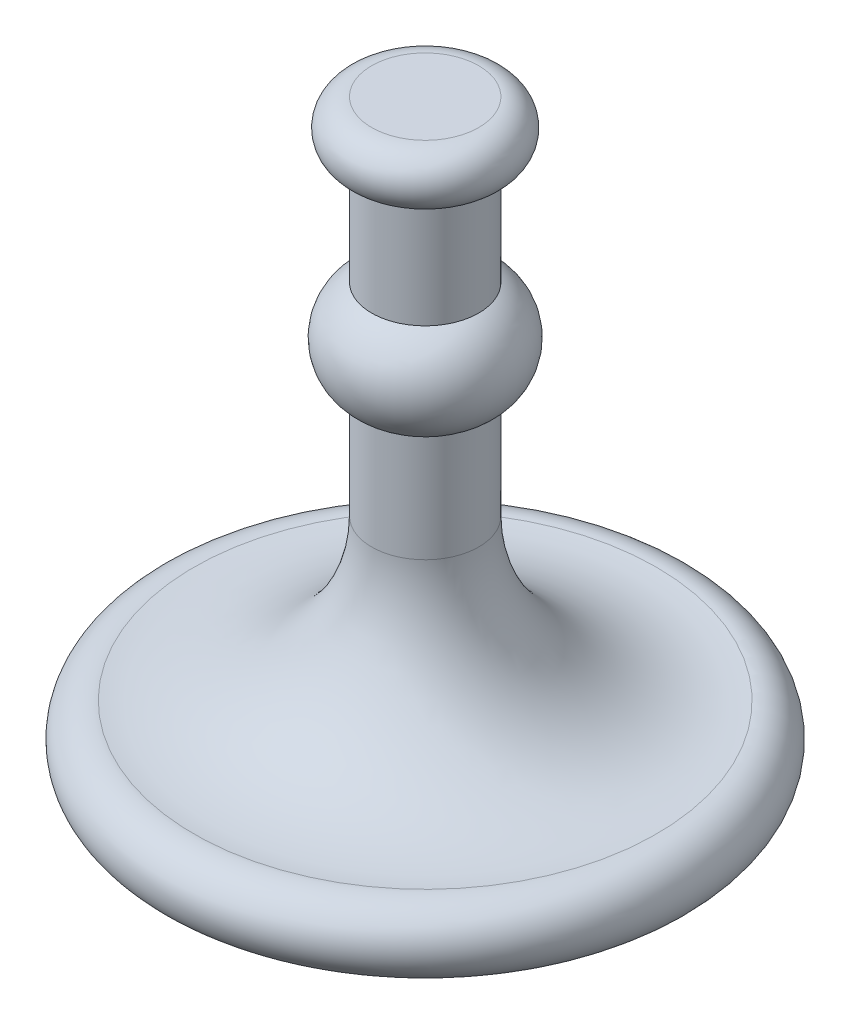
ISO-10303-21;
HEADER;
FILE_DESCRIPTION(('STEP AP214'),'2;1');
FILE_NAME('part.step','',(''),(''),'','','');
FILE_SCHEMA(('AUTOMOTIVE_DESIGN { 1 0 10303 214 1 1 1 1 }'));
ENDSEC;
DATA;
#1=APPLICATION_CONTEXT('core data for automotive mechanical design processes');
#2=APPLICATION_PROTOCOL_DEFINITION('international standard','automotive_design',2000,#1);
#3=PRODUCT_CONTEXT('',#1,'mechanical');
#4=PRODUCT('Part','Part','',(#3));
#5=PRODUCT_RELATED_PRODUCT_CATEGORY('part','',(#4));
#6=PRODUCT_DEFINITION_FORMATION('','',#4);
#7=PRODUCT_DEFINITION_CONTEXT('part definition',#1,'design');
#8=PRODUCT_DEFINITION('design','',#6,#7);
#9=PRODUCT_DEFINITION_SHAPE('','',#8);
#10=(LENGTH_UNIT() NAMED_UNIT(*) SI_UNIT(.MILLI.,.METRE.));
#11=(NAMED_UNIT(*) PLANE_ANGLE_UNIT() SI_UNIT($,.RADIAN.));
#12=(NAMED_UNIT(*) SI_UNIT($,.STERADIAN.) SOLID_ANGLE_UNIT());
#13=UNCERTAINTY_MEASURE_WITH_UNIT(LENGTH_MEASURE(1.E-05),#10,'distance_accuracy_value','');
#14=(GEOMETRIC_REPRESENTATION_CONTEXT(3) GLOBAL_UNCERTAINTY_ASSIGNED_CONTEXT((#13)) GLOBAL_UNIT_ASSIGNED_CONTEXT((#10,
#11,#12)) REPRESENTATION_CONTEXT('',''));
#15=CARTESIAN_POINT('',(0.,0.,0.));
#16=DIRECTION('',(0.,0.,1.));
#17=DIRECTION('',(1.,0.,0.));
#18=AXIS2_PLACEMENT_3D('',#15,#16,#17);
#19=CARTESIAN_POINT('',(0.,0.,0.));
#20=DIRECTION('',(0.,-1.,0.));
#21=DIRECTION('',(0.,0.,-1.));
#22=AXIS2_PLACEMENT_3D('',#19,#20,#21);
#23=PLANE('',#22);
#24=CARTESIAN_POINT('',(0.,0.,0.));
#25=DIRECTION('',(0.,-1.,0.));
#26=DIRECTION('',(0.,0.,-1.));
#27=AXIS2_PLACEMENT_3D('',#24,#25,#26);
#28=CIRCLE('',#27,90.);
#29=CARTESIAN_POINT('',(0.,0.,-90.));
#30=VERTEX_POINT('',#29);
#31=EDGE_CURVE('E74',#30,#30,#28,.T.);
#32=ORIENTED_EDGE('',*,*,#31,.T.);
#33=EDGE_LOOP('',(#32));
#34=FACE_BOUND('',#33,.T.);
#35=ADVANCED_FACE('F43',(#34),#23,.T.);
#36=CARTESIAN_POINT('',(0.,220.,0.));
#37=DIRECTION('',(0.,1.,0.));
#38=DIRECTION('',(0.,0.,1.));
#39=AXIS2_PLACEMENT_3D('',#36,#37,#38);
#40=PLANE('',#39);
#41=CARTESIAN_POINT('',(0.,220.,0.));
#42=DIRECTION('',(0.,-1.,0.));
#43=DIRECTION('',(0.,0.,-1.));
#44=AXIS2_PLACEMENT_3D('',#41,#42,#43);
#45=CIRCLE('',#44,20.);
#46=CARTESIAN_POINT('',(0.,220.,-20.));
#47=VERTEX_POINT('',#46);
#48=EDGE_CURVE('E10',#47,#47,#45,.T.);
#49=ORIENTED_EDGE('',*,*,#48,.F.);
#50=EDGE_LOOP('',(#49));
#51=FACE_BOUND('',#50,.T.);
#52=ADVANCED_FACE('F92',(#51),#40,.T.);
#53=CARTESIAN_POINT('',(0.,210.,0.));
#54=DIRECTION('',(0.,-1.,0.));
#55=DIRECTION('',(0.,0.,-1.));
#56=AXIS2_PLACEMENT_3D('',#53,#54,#55);
#57=TOROIDAL_SURFACE('',#56,20.,10.);
#58=ORIENTED_EDGE('',*,*,#48,.T.);
#59=EDGE_LOOP('',(#58));
#60=FACE_BOUND('',#59,.T.);
#61=CARTESIAN_POINT('',(0.,200.,0.));
#62=DIRECTION('',(0.,-1.,0.));
#63=DIRECTION('',(0.,0.,-1.));
#64=AXIS2_PLACEMENT_3D('',#61,#62,#63);
#65=CIRCLE('',#64,20.);
#66=CARTESIAN_POINT('',(0.,200.,-20.));
#67=VERTEX_POINT('',#66);
#68=EDGE_CURVE('E50',#67,#67,#65,.T.);
#69=ORIENTED_EDGE('',*,*,#68,.F.);
#70=EDGE_LOOP('',(#69));
#71=FACE_BOUND('',#70,.T.);
#72=ADVANCED_FACE('F96',(#60,#71),#57,.T.);
#73=CARTESIAN_POINT('',(0.,0.,0.));
#74=DIRECTION('',(0.,-1.,0.));
#75=DIRECTION('',(0.,0.,-1.));
#76=AXIS2_PLACEMENT_3D('',#73,#74,#75);
#77=CYLINDRICAL_SURFACE('',#76,20.);
#78=ORIENTED_EDGE('',*,*,#68,.T.);
#79=EDGE_LOOP('',(#78));
#80=FACE_BOUND('',#79,.T.);
#81=CARTESIAN_POINT('',(0.,160.,0.));
#82=DIRECTION('',(0.,-1.,0.));
#83=DIRECTION('',(0.,0.,-1.));
#84=AXIS2_PLACEMENT_3D('',#81,#82,#83);
#85=CIRCLE('',#84,20.);
#86=CARTESIAN_POINT('',(0.,160.,-20.));
#87=VERTEX_POINT('',#86);
#88=EDGE_CURVE('E55',#87,#87,#85,.T.);
#89=ORIENTED_EDGE('',*,*,#88,.F.);
#90=EDGE_LOOP('',(#89));
#91=FACE_BOUND('',#90,.T.);
#92=ADVANCED_FACE('F101',(#80,#91),#77,.T.);
#93=CARTESIAN_POINT('',(0.,142.185606368269,0.));
#94=DIRECTION('',(0.,-1.,0.));
#95=DIRECTION('',(0.,0.,-1.));
#96=AXIS2_PLACEMENT_3D('',#93,#94,#95);
#97=DEGENERATE_TOROIDAL_SURFACE('',#96,10.9089395814501,20.,.T.);
#98=ORIENTED_EDGE('',*,*,#88,.T.);
#99=EDGE_LOOP('',(#98));
#100=FACE_BOUND('',#99,.T.);
#101=CARTESIAN_POINT('',(0.,124.371212736537,0.));
#102=DIRECTION('',(0.,-1.,0.));
#103=DIRECTION('',(0.,0.,-1.));
#104=AXIS2_PLACEMENT_3D('',#101,#102,#103);
#105=CIRCLE('',#104,20.);
#106=CARTESIAN_POINT('',(0.,124.371212736537,-20.));
#107=VERTEX_POINT('',#106);
#108=EDGE_CURVE('E60',#107,#107,#105,.T.);
#109=ORIENTED_EDGE('',*,*,#108,.F.);
#110=EDGE_LOOP('',(#109));
#111=FACE_BOUND('',#110,.T.);
#112=ADVANCED_FACE('F106',(#100,#111),#97,.T.);
#113=CARTESIAN_POINT('',(0.,0.,0.));
#114=DIRECTION('',(0.,-1.,0.));
#115=DIRECTION('',(0.,0.,-1.));
#116=AXIS2_PLACEMENT_3D('',#113,#114,#115);
#117=CYLINDRICAL_SURFACE('',#116,20.);
#118=ORIENTED_EDGE('',*,*,#108,.T.);
#119=EDGE_LOOP('',(#118));
#120=FACE_BOUND('',#119,.T.);
#121=CARTESIAN_POINT('',(0.,84.371212736537,0.));
#122=DIRECTION('',(0.,-1.,0.));
#123=DIRECTION('',(0.,0.,-1.));
#124=AXIS2_PLACEMENT_3D('',#121,#122,#123);
#125=CIRCLE('',#124,20.);
#126=CARTESIAN_POINT('',(0.,84.371212736537,-20.));
#127=VERTEX_POINT('',#126);
#128=EDGE_CURVE('E66',#127,#127,#125,.T.);
#129=ORIENTED_EDGE('',*,*,#128,.F.);
#130=EDGE_LOOP('',(#129));
#131=FACE_BOUND('',#130,.T.);
#132=ADVANCED_FACE('F88',(#120,#131),#117,.T.);
#133=CARTESIAN_POINT('',(0.,84.371212736537,0.));
#134=DIRECTION('',(0.,-1.,0.));
#135=DIRECTION('',(0.,0.,-1.));
#136=AXIS2_PLACEMENT_3D('',#133,#134,#135);
#137=TOROIDAL_SURFACE('',#136,80.,60.);
#138=ORIENTED_EDGE('',*,*,#128,.T.);
#139=EDGE_LOOP('',(#138));
#140=FACE_BOUND('',#139,.T.);
#141=CARTESIAN_POINT('',(0.,24.704973423529,0.));
#142=DIRECTION('',(0.,-1.,0.));
#143=DIRECTION('',(0.,0.,-1.));
#144=AXIS2_PLACEMENT_3D('',#141,#142,#143);
#145=CIRCLE('',#144,86.3198011236787);
#146=CARTESIAN_POINT('',(0.,24.704973423529,-86.3198011236787));
#147=VERTEX_POINT('',#146);
#148=EDGE_CURVE('E70',#147,#147,#145,.T.);
#149=ORIENTED_EDGE('',*,*,#148,.F.);
#150=EDGE_LOOP('',(#149));
#151=FACE_BOUND('',#150,.T.);
#152=ADVANCED_FACE('F82',(#140,#151),#137,.F.);
#153=CARTESIAN_POINT('',(0.,12.2745068999856,0.));
#154=DIRECTION('',(0.,-1.,0.));
#155=DIRECTION('',(0.,0.,-1.));
#156=AXIS2_PLACEMENT_3D('',#153,#154,#155);
#157=TOROIDAL_SURFACE('',#156,87.6364263577784,12.5);
#158=ORIENTED_EDGE('',*,*,#148,.T.);
#159=EDGE_LOOP('',(#158));
#160=FACE_BOUND('',#159,.T.);
#161=ORIENTED_EDGE('',*,*,#31,.F.);
#162=EDGE_LOOP('',(#161));
#163=FACE_BOUND('',#162,.T.);
#164=ADVANCED_FACE('F80',(#160,#163),#157,.T.);
#165=CLOSED_SHELL('',(#35,#52,#72,#92,#112,#132,#152,#164));
#166=MANIFOLD_SOLID_BREP('B2',#165);
#167=ADVANCED_BREP_SHAPE_REPRESENTATION('',(#18,#166),#14);
#168=SHAPE_DEFINITION_REPRESENTATION(#9,#167);
ENDSEC;
END-ISO-10303-21;
